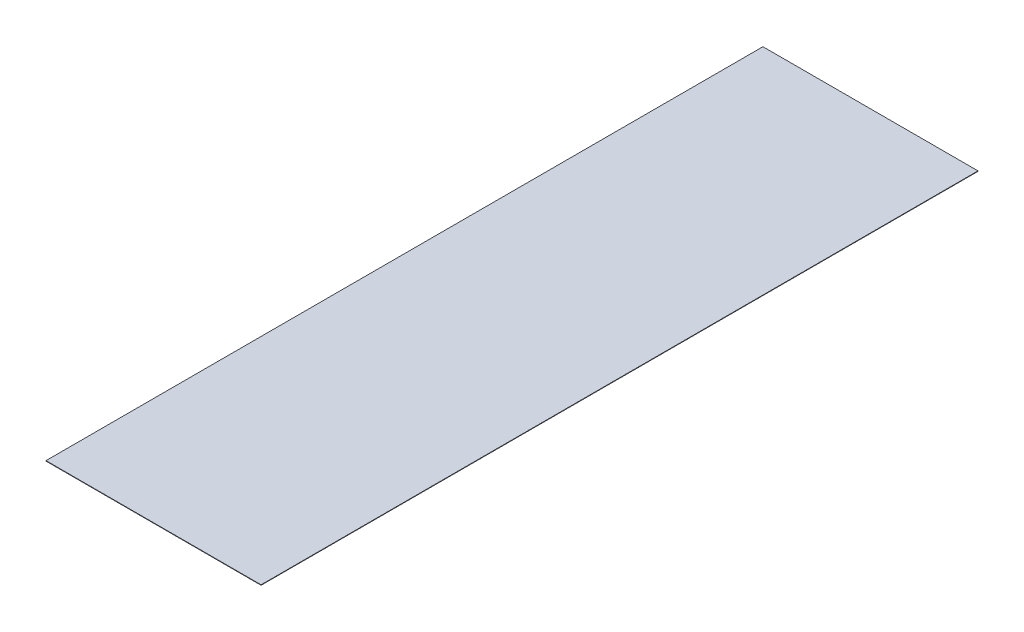
ISO-10303-21;
HEADER;
FILE_DESCRIPTION(('STEP AP214'),'2;1');
FILE_NAME('part.step','',(''),(''),'','','');
FILE_SCHEMA(('AUTOMOTIVE_DESIGN { 1 0 10303 214 1 1 1 1 }'));
ENDSEC;
DATA;
#1=APPLICATION_CONTEXT('core data for automotive mechanical design processes');
#2=APPLICATION_PROTOCOL_DEFINITION('international standard','automotive_design',2000,#1);
#3=PRODUCT_CONTEXT('',#1,'mechanical');
#4=PRODUCT('Part','Part','',(#3));
#5=PRODUCT_RELATED_PRODUCT_CATEGORY('part','',(#4));
#6=PRODUCT_DEFINITION_FORMATION('','',#4);
#7=PRODUCT_DEFINITION_CONTEXT('part definition',#1,'design');
#8=PRODUCT_DEFINITION('design','',#6,#7);
#9=PRODUCT_DEFINITION_SHAPE('','',#8);
#10=(LENGTH_UNIT() NAMED_UNIT(*) SI_UNIT(.MILLI.,.METRE.));
#11=(NAMED_UNIT(*) PLANE_ANGLE_UNIT() SI_UNIT($,.RADIAN.));
#12=(NAMED_UNIT(*) SI_UNIT($,.STERADIAN.) SOLID_ANGLE_UNIT());
#13=UNCERTAINTY_MEASURE_WITH_UNIT(LENGTH_MEASURE(1.E-05),#10,'distance_accuracy_value','');
#14=(GEOMETRIC_REPRESENTATION_CONTEXT(3) GLOBAL_UNCERTAINTY_ASSIGNED_CONTEXT((#13)) GLOBAL_UNIT_ASSIGNED_CONTEXT((#10,
#11,#12)) REPRESENTATION_CONTEXT('',''));
#15=CARTESIAN_POINT('',(0.,0.,0.));
#16=DIRECTION('',(0.,0.,1.));
#17=DIRECTION('',(1.,0.,0.));
#18=AXIS2_PLACEMENT_3D('',#15,#16,#17);
#19=CARTESIAN_POINT('',(457.2,1.9,1524.));
#20=DIRECTION('',(-1.,0.,0.));
#21=DIRECTION('',(0.,0.,1.));
#22=AXIS2_PLACEMENT_3D('',#19,#20,#21);
#23=PLANE('',#22);
#24=DIRECTION('',(0.,0.,-1.));
#25=VECTOR('',#24,1.);
#26=CARTESIAN_POINT('',(457.2,0.,1524.));
#27=LINE('',#26,#25);
#28=CARTESIAN_POINT('',(457.2,0.,1524.));
#29=VERTEX_POINT('',#28);
#30=CARTESIAN_POINT('',(457.2,0.,-1524.));
#31=VERTEX_POINT('',#30);
#32=EDGE_CURVE('E96',#29,#31,#27,.T.);
#33=ORIENTED_EDGE('',*,*,#32,.T.);
#34=DIRECTION('',(0.,-1.,0.));
#35=VECTOR('',#34,1.);
#36=CARTESIAN_POINT('',(457.2,1.9,-1524.));
#37=LINE('',#36,#35);
#38=CARTESIAN_POINT('',(457.2,1.9,-1524.));
#39=VERTEX_POINT('',#38);
#40=EDGE_CURVE('E11',#39,#31,#37,.T.);
#41=ORIENTED_EDGE('',*,*,#40,.F.);
#42=DIRECTION('',(0.,0.,-1.));
#43=VECTOR('',#42,1.);
#44=CARTESIAN_POINT('',(457.2,1.9,1524.));
#45=LINE('',#44,#43);
#46=CARTESIAN_POINT('',(457.2,1.9,1524.));
#47=VERTEX_POINT('',#46);
#48=EDGE_CURVE('E84',#47,#39,#45,.T.);
#49=ORIENTED_EDGE('',*,*,#48,.F.);
#50=DIRECTION('',(0.,-1.,0.));
#51=VECTOR('',#50,1.);
#52=CARTESIAN_POINT('',(457.2,1.9,1524.));
#53=LINE('',#52,#51);
#54=EDGE_CURVE('E92',#47,#29,#53,.T.);
#55=ORIENTED_EDGE('',*,*,#54,.T.);
#56=EDGE_LOOP('',(#33,#41,#49,#55));
#57=FACE_BOUND('',#56,.T.);
#58=ADVANCED_FACE('F33',(#57),#23,.F.);
#59=CARTESIAN_POINT('',(-457.2,1.9,-1524.));
#60=DIRECTION('',(0.,0.,1.));
#61=DIRECTION('',(1.,0.,0.));
#62=AXIS2_PLACEMENT_3D('',#59,#60,#61);
#63=PLANE('',#62);
#64=DIRECTION('',(-1.,0.,0.));
#65=VECTOR('',#64,1.);
#66=CARTESIAN_POINT('',(-457.2,0.,-1524.));
#67=LINE('',#66,#65);
#68=CARTESIAN_POINT('',(-457.2,0.,-1524.));
#69=VERTEX_POINT('',#68);
#70=EDGE_CURVE('E88',#31,#69,#67,.T.);
#71=ORIENTED_EDGE('',*,*,#70,.T.);
#72=DIRECTION('',(0.,-1.,0.));
#73=VECTOR('',#72,1.);
#74=CARTESIAN_POINT('',(-457.2,1.9,-1524.));
#75=LINE('',#74,#73);
#76=CARTESIAN_POINT('',(-457.2,1.9,-1524.));
#77=VERTEX_POINT('',#76);
#78=EDGE_CURVE('E41',#77,#69,#75,.T.);
#79=ORIENTED_EDGE('',*,*,#78,.F.);
#80=DIRECTION('',(-1.,0.,0.));
#81=VECTOR('',#80,1.);
#82=CARTESIAN_POINT('',(-457.2,1.9,-1524.));
#83=LINE('',#82,#81);
#84=EDGE_CURVE('E79',#39,#77,#83,.T.);
#85=ORIENTED_EDGE('',*,*,#84,.F.);
#86=ORIENTED_EDGE('',*,*,#40,.T.);
#87=EDGE_LOOP('',(#71,#79,#85,#86));
#88=FACE_BOUND('',#87,.T.);
#89=ADVANCED_FACE('F87',(#88),#63,.F.);
#90=CARTESIAN_POINT('',(-457.2,1.9,1524.));
#91=DIRECTION('',(1.,0.,0.));
#92=DIRECTION('',(0.,0.,-1.));
#93=AXIS2_PLACEMENT_3D('',#90,#91,#92);
#94=PLANE('',#93);
#95=DIRECTION('',(0.,0.,1.));
#96=VECTOR('',#95,1.);
#97=CARTESIAN_POINT('',(-457.2,0.,1524.));
#98=LINE('',#97,#96);
#99=CARTESIAN_POINT('',(-457.2,0.,1524.));
#100=VERTEX_POINT('',#99);
#101=EDGE_CURVE('E66',#69,#100,#98,.T.);
#102=ORIENTED_EDGE('',*,*,#101,.T.);
#103=DIRECTION('',(0.,-1.,0.));
#104=VECTOR('',#103,1.);
#105=CARTESIAN_POINT('',(-457.2,1.9,1524.));
#106=LINE('',#105,#104);
#107=CARTESIAN_POINT('',(-457.2,1.9,1524.));
#108=VERTEX_POINT('',#107);
#109=EDGE_CURVE('E89',#108,#100,#106,.T.);
#110=ORIENTED_EDGE('',*,*,#109,.F.);
#111=DIRECTION('',(0.,0.,1.));
#112=VECTOR('',#111,1.);
#113=CARTESIAN_POINT('',(-457.2,1.9,1524.));
#114=LINE('',#113,#112);
#115=EDGE_CURVE('E82',#77,#108,#114,.T.);
#116=ORIENTED_EDGE('',*,*,#115,.F.);
#117=ORIENTED_EDGE('',*,*,#78,.T.);
#118=EDGE_LOOP('',(#102,#110,#116,#117));
#119=FACE_BOUND('',#118,.T.);
#120=ADVANCED_FACE('F90',(#119),#94,.F.);
#121=CARTESIAN_POINT('',(-457.2,1.9,1524.));
#122=DIRECTION('',(0.,0.,-1.));
#123=DIRECTION('',(-1.,0.,0.));
#124=AXIS2_PLACEMENT_3D('',#121,#122,#123);
#125=PLANE('',#124);
#126=DIRECTION('',(1.,0.,0.));
#127=VECTOR('',#126,1.);
#128=CARTESIAN_POINT('',(-457.2,0.,1524.));
#129=LINE('',#128,#127);
#130=EDGE_CURVE('E72',#100,#29,#129,.T.);
#131=ORIENTED_EDGE('',*,*,#130,.T.);
#132=ORIENTED_EDGE('',*,*,#54,.F.);
#133=DIRECTION('',(1.,0.,0.));
#134=VECTOR('',#133,1.);
#135=CARTESIAN_POINT('',(-457.2,1.9,1524.));
#136=LINE('',#135,#134);
#137=EDGE_CURVE('E49',#108,#47,#136,.T.);
#138=ORIENTED_EDGE('',*,*,#137,.F.);
#139=ORIENTED_EDGE('',*,*,#109,.T.);
#140=EDGE_LOOP('',(#131,#132,#138,#139));
#141=FACE_BOUND('',#140,.T.);
#142=ADVANCED_FACE('F103',(#141),#125,.F.);
#143=CARTESIAN_POINT('',(0.,1.9,0.));
#144=DIRECTION('',(0.,-1.,0.));
#145=DIRECTION('',(0.,0.,-1.));
#146=AXIS2_PLACEMENT_3D('',#143,#144,#145);
#147=PLANE('',#146);
#148=ORIENTED_EDGE('',*,*,#48,.T.);
#149=ORIENTED_EDGE('',*,*,#84,.T.);
#150=ORIENTED_EDGE('',*,*,#115,.T.);
#151=ORIENTED_EDGE('',*,*,#137,.T.);
#152=EDGE_LOOP('',(#148,#149,#150,#151));
#153=FACE_BOUND('',#152,.T.);
#154=ADVANCED_FACE('F80',(#153),#147,.F.);
#155=CARTESIAN_POINT('',(0.,0.,0.));
#156=DIRECTION('',(0.,-1.,0.));
#157=DIRECTION('',(0.,0.,-1.));
#158=AXIS2_PLACEMENT_3D('',#155,#156,#157);
#159=PLANE('',#158);
#160=ORIENTED_EDGE('',*,*,#32,.F.);
#161=ORIENTED_EDGE('',*,*,#130,.F.);
#162=ORIENTED_EDGE('',*,*,#101,.F.);
#163=ORIENTED_EDGE('',*,*,#70,.F.);
#164=EDGE_LOOP('',(#160,#161,#162,#163));
#165=FACE_BOUND('',#164,.T.);
#166=ADVANCED_FACE('F106',(#165),#159,.T.);
#167=CLOSED_SHELL('',(#58,#89,#120,#142,#154,#166));
#168=MANIFOLD_SOLID_BREP('B2',#167);
#169=ADVANCED_BREP_SHAPE_REPRESENTATION('',(#18,#168),#14);
#170=SHAPE_DEFINITION_REPRESENTATION(#9,#169);
ENDSEC;
END-ISO-10303-21;
